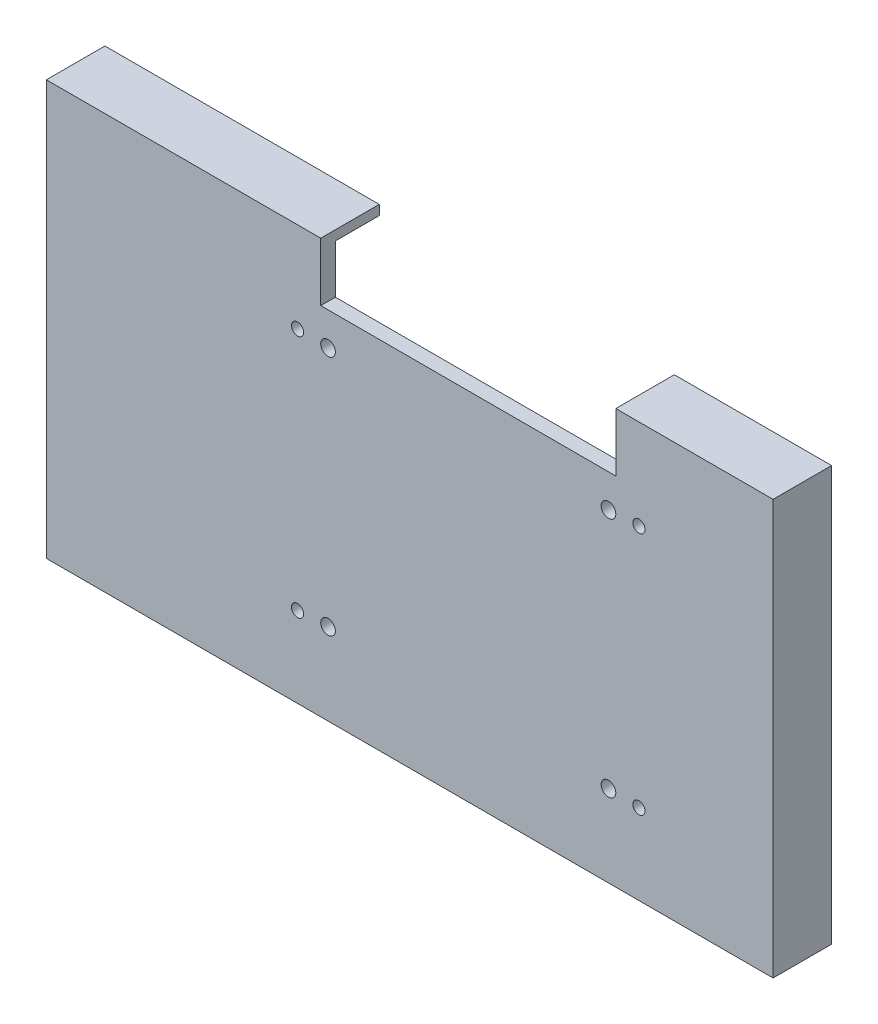
ISO-10303-21;
HEADER;
FILE_DESCRIPTION(('STEP AP214'),'2;1');
FILE_NAME('part.step','',(''),(''),'','','');
FILE_SCHEMA(('AUTOMOTIVE_DESIGN { 1 0 10303 214 1 1 1 1 }'));
ENDSEC;
DATA;
#1=APPLICATION_CONTEXT('core data for automotive mechanical design processes');
#2=APPLICATION_PROTOCOL_DEFINITION('international standard','automotive_design',2000,#1);
#3=PRODUCT_CONTEXT('',#1,'mechanical');
#4=PRODUCT('Part','Part','',(#3));
#5=PRODUCT_RELATED_PRODUCT_CATEGORY('part','',(#4));
#6=PRODUCT_DEFINITION_FORMATION('','',#4);
#7=PRODUCT_DEFINITION_CONTEXT('part definition',#1,'design');
#8=PRODUCT_DEFINITION('design','',#6,#7);
#9=PRODUCT_DEFINITION_SHAPE('','',#8);
#10=(LENGTH_UNIT() NAMED_UNIT(*) SI_UNIT(.MILLI.,.METRE.));
#11=(NAMED_UNIT(*) PLANE_ANGLE_UNIT() SI_UNIT($,.RADIAN.));
#12=(NAMED_UNIT(*) SI_UNIT($,.STERADIAN.) SOLID_ANGLE_UNIT());
#13=UNCERTAINTY_MEASURE_WITH_UNIT(LENGTH_MEASURE(1.E-05),#10,'distance_accuracy_value','');
#14=(GEOMETRIC_REPRESENTATION_CONTEXT(3) GLOBAL_UNCERTAINTY_ASSIGNED_CONTEXT((#13)) GLOBAL_UNIT_ASSIGNED_CONTEXT((#10,
#11,#12)) REPRESENTATION_CONTEXT('',''));
#15=CARTESIAN_POINT('',(0.,0.,0.));
#16=DIRECTION('',(0.,0.,1.));
#17=DIRECTION('',(1.,0.,0.));
#18=AXIS2_PLACEMENT_3D('',#15,#16,#17);
#19=CARTESIAN_POINT('',(0.,-15.,-3.));
#20=DIRECTION('',(0.,-1.,0.));
#21=DIRECTION('',(0.,0.,-1.));
#22=AXIS2_PLACEMENT_3D('',#19,#20,#21);
#23=PLANE('',#22);
#24=DIRECTION('',(0.,0.,1.));
#25=VECTOR('',#24,1.);
#26=CARTESIAN_POINT('',(-63.6600662353482,-15.,-3.));
#27=LINE('',#26,#25);
#28=CARTESIAN_POINT('',(-63.6600662353482,-15.,-3.));
#29=VERTEX_POINT('',#28);
#30=CARTESIAN_POINT('',(-63.6600662353482,-15.,-1.));
#31=VERTEX_POINT('',#30);
#32=EDGE_CURVE('E86',#29,#31,#27,.T.);
#33=ORIENTED_EDGE('',*,*,#32,.T.);
#34=DIRECTION('',(-1.,0.,0.));
#35=VECTOR('',#34,1.);
#36=CARTESIAN_POINT('',(0.,-15.,-1.));
#37=LINE('',#36,#35);
#38=CARTESIAN_POINT('',(-86.5,-15.,-1.));
#39=VERTEX_POINT('',#38);
#40=EDGE_CURVE('E292',#31,#39,#37,.T.);
#41=ORIENTED_EDGE('',*,*,#40,.T.);
#42=DIRECTION('',(0.,0.,1.));
#43=VECTOR('',#42,1.);
#44=CARTESIAN_POINT('',(-86.5,-15.,-12.));
#45=LINE('',#44,#43);
#46=CARTESIAN_POINT('',(-86.5,-15.,-12.));
#47=VERTEX_POINT('',#46);
#48=EDGE_CURVE('E340',#47,#39,#45,.T.);
#49=ORIENTED_EDGE('',*,*,#48,.F.);
#50=DIRECTION('',(1.,0.,0.));
#51=VECTOR('',#50,1.);
#52=CARTESIAN_POINT('',(0.,-15.,-12.));
#53=LINE('',#52,#51);
#54=CARTESIAN_POINT('',(-84.5,-15.,-12.));
#55=VERTEX_POINT('',#54);
#56=EDGE_CURVE('E326',#47,#55,#53,.T.);
#57=ORIENTED_EDGE('',*,*,#56,.T.);
#58=DIRECTION('',(0.,0.,1.));
#59=VECTOR('',#58,1.);
#60=CARTESIAN_POINT('',(-84.5,-15.,-12.));
#61=LINE('',#60,#59);
#62=CARTESIAN_POINT('',(-84.5,-15.,-3.));
#63=VERTEX_POINT('',#62);
#64=EDGE_CURVE('E355',#55,#63,#61,.T.);
#65=ORIENTED_EDGE('',*,*,#64,.T.);
#66=DIRECTION('',(1.,0.,0.));
#67=VECTOR('',#66,1.);
#68=CARTESIAN_POINT('',(0.,-15.,-3.));
#69=LINE('',#68,#67);
#70=EDGE_CURVE('E216',#63,#29,#69,.T.);
#71=ORIENTED_EDGE('',*,*,#70,.T.);
#72=EDGE_LOOP('',(#33,#41,#49,#57,#65,#71));
#73=FACE_BOUND('',#72,.T.);
#74=ADVANCED_FACE('F82',(#73),#23,.T.);
#75=CARTESIAN_POINT('',(0.,-30.,-3.));
#76=DIRECTION('',(0.,-1.,0.));
#77=DIRECTION('',(0.,0.,-1.));
#78=AXIS2_PLACEMENT_3D('',#75,#76,#77);
#79=PLANE('',#78);
#80=DIRECTION('',(-1.,0.,0.));
#81=VECTOR('',#80,1.);
#82=CARTESIAN_POINT('',(0.,-30.,-1.));
#83=LINE('',#82,#81);
#84=CARTESIAN_POINT('',(-63.6600662353482,-30.,-1.));
#85=VERTEX_POINT('',#84);
#86=CARTESIAN_POINT('',(-86.5,-30.,-1.));
#87=VERTEX_POINT('',#86);
#88=EDGE_CURVE('E308',#85,#87,#83,.T.);
#89=ORIENTED_EDGE('',*,*,#88,.F.);
#90=DIRECTION('',(0.,0.,1.));
#91=VECTOR('',#90,1.);
#92=CARTESIAN_POINT('',(-63.6600662353482,-30.,-3.));
#93=LINE('',#92,#91);
#94=CARTESIAN_POINT('',(-63.6600662353482,-30.,-3.));
#95=VERTEX_POINT('',#94);
#96=EDGE_CURVE('E279',#95,#85,#93,.T.);
#97=ORIENTED_EDGE('',*,*,#96,.F.);
#98=DIRECTION('',(1.,0.,0.));
#99=VECTOR('',#98,1.);
#100=CARTESIAN_POINT('',(0.,-30.,-3.));
#101=LINE('',#100,#99);
#102=CARTESIAN_POINT('',(-84.5,-30.,-3.));
#103=VERTEX_POINT('',#102);
#104=EDGE_CURVE('E222',#103,#95,#101,.T.);
#105=ORIENTED_EDGE('',*,*,#104,.F.);
#106=DIRECTION('',(0.,0.,1.));
#107=VECTOR('',#106,1.);
#108=CARTESIAN_POINT('',(-84.5,-30.,-12.));
#109=LINE('',#108,#107);
#110=CARTESIAN_POINT('',(-84.5,-30.,-12.));
#111=VERTEX_POINT('',#110);
#112=EDGE_CURVE('E251',#111,#103,#109,.T.);
#113=ORIENTED_EDGE('',*,*,#112,.F.);
#114=DIRECTION('',(1.,0.,0.));
#115=VECTOR('',#114,1.);
#116=CARTESIAN_POINT('',(0.,-30.,-12.));
#117=LINE('',#116,#115);
#118=CARTESIAN_POINT('',(-86.5,-30.,-12.));
#119=VERTEX_POINT('',#118);
#120=EDGE_CURVE('E358',#119,#111,#117,.T.);
#121=ORIENTED_EDGE('',*,*,#120,.F.);
#122=DIRECTION('',(0.,0.,1.));
#123=VECTOR('',#122,1.);
#124=CARTESIAN_POINT('',(-86.5,-30.,-12.));
#125=LINE('',#124,#123);
#126=EDGE_CURVE('E200',#119,#87,#125,.T.);
#127=ORIENTED_EDGE('',*,*,#126,.T.);
#128=EDGE_LOOP('',(#89,#97,#105,#113,#121,#127));
#129=FACE_BOUND('',#128,.T.);
#130=ADVANCED_FACE('F306',(#129),#79,.F.);
#131=CARTESIAN_POINT('',(-63.6600662353482,0.,-3.));
#132=DIRECTION('',(-1.,0.,0.));
#133=DIRECTION('',(0.,0.,1.));
#134=AXIS2_PLACEMENT_3D('',#131,#132,#133);
#135=PLANE('',#134);
#136=ORIENTED_EDGE('',*,*,#96,.T.);
#137=DIRECTION('',(0.,1.,0.));
#138=VECTOR('',#137,1.);
#139=CARTESIAN_POINT('',(-63.6600662353482,0.,-1.));
#140=LINE('',#139,#138);
#141=EDGE_CURVE('E299',#85,#31,#140,.T.);
#142=ORIENTED_EDGE('',*,*,#141,.T.);
#143=ORIENTED_EDGE('',*,*,#32,.F.);
#144=DIRECTION('',(0.,-1.,0.));
#145=VECTOR('',#144,1.);
#146=CARTESIAN_POINT('',(-63.6600662353482,0.,-3.));
#147=LINE('',#146,#145);
#148=EDGE_CURVE('E219',#29,#95,#147,.T.);
#149=ORIENTED_EDGE('',*,*,#148,.T.);
#150=EDGE_LOOP('',(#136,#142,#143,#149));
#151=FACE_BOUND('',#150,.T.);
#152=ADVANCED_FACE('F297',(#151),#135,.T.);
#153=CARTESIAN_POINT('',(-30.25,0.,-3.));
#154=DIRECTION('',(-1.,0.,0.));
#155=DIRECTION('',(0.,0.,1.));
#156=AXIS2_PLACEMENT_3D('',#153,#154,#155);
#157=PLANE('',#156);
#158=DIRECTION('',(0.,-1.,0.));
#159=VECTOR('',#158,1.);
#160=CARTESIAN_POINT('',(-30.25,0.,0.));
#161=LINE('',#160,#159);
#162=CARTESIAN_POINT('',(-30.25,43.5,0.));
#163=VERTEX_POINT('',#162);
#164=CARTESIAN_POINT('',(-30.25,31.5205042156634,0.));
#165=VERTEX_POINT('',#164);
#166=EDGE_CURVE('E265',#163,#165,#161,.T.);
#167=ORIENTED_EDGE('',*,*,#166,.T.);
#168=DIRECTION('',(0.,0.,1.));
#169=VECTOR('',#168,1.);
#170=CARTESIAN_POINT('',(-30.25,31.5205042156634,-3.));
#171=LINE('',#170,#169);
#172=CARTESIAN_POINT('',(-30.25,31.5205042156634,-3.));
#173=VERTEX_POINT('',#172);
#174=EDGE_CURVE('E12',#173,#165,#171,.T.);
#175=ORIENTED_EDGE('',*,*,#174,.F.);
#176=DIRECTION('',(0.,-1.,0.));
#177=VECTOR('',#176,1.);
#178=CARTESIAN_POINT('',(-30.25,0.,-3.));
#179=LINE('',#178,#177);
#180=CARTESIAN_POINT('',(-30.25,41.5,-3.));
#181=VERTEX_POINT('',#180);
#182=EDGE_CURVE('E233',#181,#173,#179,.T.);
#183=ORIENTED_EDGE('',*,*,#182,.F.);
#184=DIRECTION('',(0.,0.,1.));
#185=VECTOR('',#184,1.);
#186=CARTESIAN_POINT('',(-30.25,41.5,-12.));
#187=LINE('',#186,#185);
#188=CARTESIAN_POINT('',(-30.25,41.5,-12.));
#189=VERTEX_POINT('',#188);
#190=EDGE_CURVE('E349',#189,#181,#187,.T.);
#191=ORIENTED_EDGE('',*,*,#190,.F.);
#192=DIRECTION('',(0.,-1.,0.));
#193=VECTOR('',#192,1.);
#194=CARTESIAN_POINT('',(-30.25,0.,-12.));
#195=LINE('',#194,#193);
#196=CARTESIAN_POINT('',(-30.25,43.5,-12.));
#197=VERTEX_POINT('',#196);
#198=EDGE_CURVE('E335',#197,#189,#195,.T.);
#199=ORIENTED_EDGE('',*,*,#198,.F.);
#200=DIRECTION('',(0.,0.,1.));
#201=VECTOR('',#200,1.);
#202=CARTESIAN_POINT('',(-30.25,43.5,-12.));
#203=LINE('',#202,#201);
#204=EDGE_CURVE('E346',#197,#163,#203,.T.);
#205=ORIENTED_EDGE('',*,*,#204,.T.);
#206=EDGE_LOOP('',(#167,#175,#183,#191,#199,#205));
#207=FACE_BOUND('',#206,.T.);
#208=ADVANCED_FACE('F467',(#207),#157,.F.);
#209=CARTESIAN_POINT('',(0.,31.5205042156634,-3.));
#210=DIRECTION('',(0.,-1.,0.));
#211=DIRECTION('',(1.,0.,0.));
#212=AXIS2_PLACEMENT_3D('',#209,#210,#211);
#213=PLANE('',#212);
#214=DIRECTION('',(1.,0.,0.));
#215=VECTOR('',#214,1.);
#216=CARTESIAN_POINT('',(0.,31.5205042156634,0.));
#217=LINE('',#216,#215);
#218=CARTESIAN_POINT('',(30.25,31.5205042156634,0.));
#219=VERTEX_POINT('',#218);
#220=EDGE_CURVE('E263',#165,#219,#217,.T.);
#221=ORIENTED_EDGE('',*,*,#220,.T.);
#222=DIRECTION('',(0.,0.,1.));
#223=VECTOR('',#222,1.);
#224=CARTESIAN_POINT('',(30.25,31.5205042156634,-3.));
#225=LINE('',#224,#223);
#226=CARTESIAN_POINT('',(30.25,31.5205042156634,-3.));
#227=VERTEX_POINT('',#226);
#228=EDGE_CURVE('E92',#227,#219,#225,.T.);
#229=ORIENTED_EDGE('',*,*,#228,.F.);
#230=DIRECTION('',(1.,0.,0.));
#231=VECTOR('',#230,1.);
#232=CARTESIAN_POINT('',(0.,31.5205042156634,-3.));
#233=LINE('',#232,#231);
#234=EDGE_CURVE('E100',#173,#227,#233,.T.);
#235=ORIENTED_EDGE('',*,*,#234,.F.);
#236=ORIENTED_EDGE('',*,*,#174,.T.);
#237=EDGE_LOOP('',(#221,#229,#235,#236));
#238=FACE_BOUND('',#237,.T.);
#239=ADVANCED_FACE('F468',(#238),#213,.F.);
#240=CARTESIAN_POINT('',(30.25,0.,-3.));
#241=DIRECTION('',(-1.,0.,0.));
#242=DIRECTION('',(0.,-1.,0.));
#243=AXIS2_PLACEMENT_3D('',#240,#241,#242);
#244=PLANE('',#243);
#245=DIRECTION('',(0.,-1.,0.));
#246=VECTOR('',#245,1.);
#247=CARTESIAN_POINT('',(30.25,0.,0.));
#248=LINE('',#247,#246);
#249=CARTESIAN_POINT('',(30.25,43.5,0.));
#250=VERTEX_POINT('',#249);
#251=EDGE_CURVE('E260',#250,#219,#248,.T.);
#252=ORIENTED_EDGE('',*,*,#251,.F.);
#253=DIRECTION('',(0.,0.,1.));
#254=VECTOR('',#253,1.);
#255=CARTESIAN_POINT('',(30.25,43.5,-12.));
#256=LINE('',#255,#254);
#257=CARTESIAN_POINT('',(30.25,43.5,-12.));
#258=VERTEX_POINT('',#257);
#259=EDGE_CURVE('E185',#258,#250,#256,.T.);
#260=ORIENTED_EDGE('',*,*,#259,.F.);
#261=DIRECTION('',(0.,-1.,0.));
#262=VECTOR('',#261,1.);
#263=CARTESIAN_POINT('',(30.25,0.,-12.));
#264=LINE('',#263,#262);
#265=CARTESIAN_POINT('',(30.25,41.5,-12.));
#266=VERTEX_POINT('',#265);
#267=EDGE_CURVE('E184',#258,#266,#264,.T.);
#268=ORIENTED_EDGE('',*,*,#267,.T.);
#269=DIRECTION('',(0.,0.,1.));
#270=VECTOR('',#269,1.);
#271=CARTESIAN_POINT('',(30.25,41.5,-12.));
#272=LINE('',#271,#270);
#273=CARTESIAN_POINT('',(30.25,41.5,-3.));
#274=VERTEX_POINT('',#273);
#275=EDGE_CURVE('E173',#266,#274,#272,.T.);
#276=ORIENTED_EDGE('',*,*,#275,.T.);
#277=DIRECTION('',(0.,-1.,0.));
#278=VECTOR('',#277,1.);
#279=CARTESIAN_POINT('',(30.25,0.,-3.));
#280=LINE('',#279,#278);
#281=EDGE_CURVE('E158',#274,#227,#280,.T.);
#282=ORIENTED_EDGE('',*,*,#281,.T.);
#283=ORIENTED_EDGE('',*,*,#228,.T.);
#284=EDGE_LOOP('',(#252,#260,#268,#276,#282,#283));
#285=FACE_BOUND('',#284,.T.);
#286=ADVANCED_FACE('F181',(#285),#244,.T.);
#287=CARTESIAN_POINT('',(35.,-25.,-3.));
#288=DIRECTION('',(0.,0.,1.));
#289=DIRECTION('',(1.,0.,0.));
#290=AXIS2_PLACEMENT_3D('',#287,#288,#289);
#291=CYLINDRICAL_SURFACE('',#290,1.25);
#292=CARTESIAN_POINT('',(35.,-25.,-3.));
#293=DIRECTION('',(0.,0.,1.));
#294=DIRECTION('',(1.,0.,0.));
#295=AXIS2_PLACEMENT_3D('',#292,#293,#294);
#296=CIRCLE('',#295,1.25);
#297=CARTESIAN_POINT('',(36.25,-25.,-3.));
#298=VERTEX_POINT('',#297);
#299=EDGE_CURVE('E241',#298,#298,#296,.T.);
#300=ORIENTED_EDGE('',*,*,#299,.F.);
#301=EDGE_LOOP('',(#300));
#302=FACE_BOUND('',#301,.T.);
#303=CARTESIAN_POINT('',(35.,-25.,0.));
#304=DIRECTION('',(0.,0.,1.));
#305=DIRECTION('',(1.,0.,0.));
#306=AXIS2_PLACEMENT_3D('',#303,#304,#305);
#307=CIRCLE('',#306,1.25);
#308=CARTESIAN_POINT('',(36.25,-25.,0.));
#309=VERTEX_POINT('',#308);
#310=EDGE_CURVE('E274',#309,#309,#307,.T.);
#311=ORIENTED_EDGE('',*,*,#310,.T.);
#312=EDGE_LOOP('',(#311));
#313=FACE_BOUND('',#312,.T.);
#314=ADVANCED_FACE('F545',(#302,#313),#291,.F.);
#315=CARTESIAN_POINT('',(-28.75,-24.75,-3.));
#316=DIRECTION('',(0.,0.,1.));
#317=DIRECTION('',(1.,0.,0.));
#318=AXIS2_PLACEMENT_3D('',#315,#316,#317);
#319=CYLINDRICAL_SURFACE('',#318,1.5);
#320=CARTESIAN_POINT('',(-28.75,-24.75,-3.));
#321=DIRECTION('',(0.,0.,1.));
#322=DIRECTION('',(1.,0.,0.));
#323=AXIS2_PLACEMENT_3D('',#320,#321,#322);
#324=CIRCLE('',#323,1.5);
#325=CARTESIAN_POINT('',(-27.25,-24.75,-3.));
#326=VERTEX_POINT('',#325);
#327=EDGE_CURVE('E238',#326,#326,#324,.F.);
#328=ORIENTED_EDGE('',*,*,#327,.T.);
#329=EDGE_LOOP('',(#328));
#330=FACE_BOUND('',#329,.T.);
#331=CARTESIAN_POINT('',(-28.75,-24.75,0.));
#332=DIRECTION('',(0.,0.,1.));
#333=DIRECTION('',(1.,0.,0.));
#334=AXIS2_PLACEMENT_3D('',#331,#332,#333);
#335=CIRCLE('',#334,1.5);
#336=CARTESIAN_POINT('',(-27.25,-24.75,0.));
#337=VERTEX_POINT('',#336);
#338=EDGE_CURVE('E271',#337,#337,#335,.F.);
#339=ORIENTED_EDGE('',*,*,#338,.F.);
#340=EDGE_LOOP('',(#339));
#341=FACE_BOUND('',#340,.T.);
#342=ADVANCED_FACE('F548',(#330,#341),#319,.F.);
#343=CARTESIAN_POINT('',(28.75,-24.75,-3.));
#344=DIRECTION('',(0.,0.,1.));
#345=DIRECTION('',(1.,0.,0.));
#346=AXIS2_PLACEMENT_3D('',#343,#344,#345);
#347=CYLINDRICAL_SURFACE('',#346,1.5);
#348=CARTESIAN_POINT('',(28.75,-24.75,-3.));
#349=DIRECTION('',(0.,0.,1.));
#350=DIRECTION('',(1.,0.,0.));
#351=AXIS2_PLACEMENT_3D('',#348,#349,#350);
#352=CIRCLE('',#351,1.5);
#353=CARTESIAN_POINT('',(30.25,-24.75,-3.));
#354=VERTEX_POINT('',#353);
#355=EDGE_CURVE('E235',#354,#354,#352,.T.);
#356=ORIENTED_EDGE('',*,*,#355,.F.);
#357=EDGE_LOOP('',(#356));
#358=FACE_BOUND('',#357,.T.);
#359=CARTESIAN_POINT('',(28.75,-24.75,0.));
#360=DIRECTION('',(0.,0.,1.));
#361=DIRECTION('',(1.,0.,0.));
#362=AXIS2_PLACEMENT_3D('',#359,#360,#361);
#363=CIRCLE('',#362,1.5);
#364=CARTESIAN_POINT('',(30.25,-24.75,0.));
#365=VERTEX_POINT('',#364);
#366=EDGE_CURVE('E268',#365,#365,#363,.T.);
#367=ORIENTED_EDGE('',*,*,#366,.T.);
#368=EDGE_LOOP('',(#367));
#369=FACE_BOUND('',#368,.T.);
#370=ADVANCED_FACE('F504',(#358,#369),#347,.F.);
#371=CARTESIAN_POINT('',(-28.75,24.75,-3.));
#372=DIRECTION('',(0.,0.,1.));
#373=DIRECTION('',(1.,0.,0.));
#374=AXIS2_PLACEMENT_3D('',#371,#372,#373);
#375=CYLINDRICAL_SURFACE('',#374,1.5);
#376=CARTESIAN_POINT('',(-28.75,24.75,-3.));
#377=DIRECTION('',(0.,0.,1.));
#378=DIRECTION('',(1.,0.,0.));
#379=AXIS2_PLACEMENT_3D('',#376,#377,#378);
#380=CIRCLE('',#379,1.5);
#381=CARTESIAN_POINT('',(-27.25,24.75,-3.));
#382=VERTEX_POINT('',#381);
#383=EDGE_CURVE('E213',#382,#382,#380,.T.);
#384=ORIENTED_EDGE('',*,*,#383,.F.);
#385=EDGE_LOOP('',(#384));
#386=FACE_BOUND('',#385,.T.);
#387=CARTESIAN_POINT('',(-28.75,24.75,0.));
#388=DIRECTION('',(0.,0.,1.));
#389=DIRECTION('',(1.,0.,0.));
#390=AXIS2_PLACEMENT_3D('',#387,#388,#389);
#391=CIRCLE('',#390,1.5);
#392=CARTESIAN_POINT('',(-27.25,24.75,0.));
#393=VERTEX_POINT('',#392);
#394=EDGE_CURVE('E257',#393,#393,#391,.T.);
#395=ORIENTED_EDGE('',*,*,#394,.T.);
#396=EDGE_LOOP('',(#395));
#397=FACE_BOUND('',#396,.T.);
#398=ADVANCED_FACE('F500',(#386,#397),#375,.F.);
#399=CARTESIAN_POINT('',(28.75,24.75,-3.));
#400=DIRECTION('',(0.,0.,1.));
#401=DIRECTION('',(1.,0.,0.));
#402=AXIS2_PLACEMENT_3D('',#399,#400,#401);
#403=CYLINDRICAL_SURFACE('',#402,1.5);
#404=CARTESIAN_POINT('',(28.75,24.75,-3.));
#405=DIRECTION('',(0.,0.,1.));
#406=DIRECTION('',(1.,0.,0.));
#407=AXIS2_PLACEMENT_3D('',#404,#405,#406);
#408=CIRCLE('',#407,1.5);
#409=CARTESIAN_POINT('',(30.25,24.75,-3.));
#410=VERTEX_POINT('',#409);
#411=EDGE_CURVE('E210',#410,#410,#408,.F.);
#412=ORIENTED_EDGE('',*,*,#411,.T.);
#413=EDGE_LOOP('',(#412));
#414=FACE_BOUND('',#413,.T.);
#415=CARTESIAN_POINT('',(28.75,24.75,0.));
#416=DIRECTION('',(0.,0.,1.));
#417=DIRECTION('',(1.,0.,0.));
#418=AXIS2_PLACEMENT_3D('',#415,#416,#417);
#419=CIRCLE('',#418,1.5);
#420=CARTESIAN_POINT('',(30.25,24.75,0.));
#421=VERTEX_POINT('',#420);
#422=EDGE_CURVE('E254',#421,#421,#419,.F.);
#423=ORIENTED_EDGE('',*,*,#422,.F.);
#424=EDGE_LOOP('',(#423));
#425=FACE_BOUND('',#424,.T.);
#426=ADVANCED_FACE('F503',(#414,#425),#403,.F.);
#427=CARTESIAN_POINT('',(-35.,25.,-3.));
#428=DIRECTION('',(0.,0.,1.));
#429=DIRECTION('',(1.,0.,0.));
#430=AXIS2_PLACEMENT_3D('',#427,#428,#429);
#431=CYLINDRICAL_SURFACE('',#430,1.25);
#432=CARTESIAN_POINT('',(-35.,25.,-3.));
#433=DIRECTION('',(0.,0.,1.));
#434=DIRECTION('',(1.,0.,0.));
#435=AXIS2_PLACEMENT_3D('',#432,#433,#434);
#436=CIRCLE('',#435,1.25);
#437=CARTESIAN_POINT('',(-33.75,25.,-3.));
#438=VERTEX_POINT('',#437);
#439=EDGE_CURVE('E206',#438,#438,#436,.T.);
#440=ORIENTED_EDGE('',*,*,#439,.F.);
#441=EDGE_LOOP('',(#440));
#442=FACE_BOUND('',#441,.T.);
#443=CARTESIAN_POINT('',(-35.,25.,0.));
#444=DIRECTION('',(0.,0.,1.));
#445=DIRECTION('',(1.,0.,0.));
#446=AXIS2_PLACEMENT_3D('',#443,#444,#445);
#447=CIRCLE('',#446,1.25);
#448=CARTESIAN_POINT('',(-33.75,25.,0.));
#449=VERTEX_POINT('',#448);
#450=EDGE_CURVE('E250',#449,#449,#447,.T.);
#451=ORIENTED_EDGE('',*,*,#450,.T.);
#452=EDGE_LOOP('',(#451));
#453=FACE_BOUND('',#452,.T.);
#454=ADVANCED_FACE('F507',(#442,#453),#431,.F.);
#455=CARTESIAN_POINT('',(35.,25.,-3.));
#456=DIRECTION('',(0.,0.,1.));
#457=DIRECTION('',(1.,0.,0.));
#458=AXIS2_PLACEMENT_3D('',#455,#456,#457);
#459=CYLINDRICAL_SURFACE('',#458,1.25);
#460=CARTESIAN_POINT('',(35.,25.,-3.));
#461=DIRECTION('',(0.,0.,1.));
#462=DIRECTION('',(1.,0.,0.));
#463=AXIS2_PLACEMENT_3D('',#460,#461,#462);
#464=CIRCLE('',#463,1.25);
#465=CARTESIAN_POINT('',(36.25,25.,-3.));
#466=VERTEX_POINT('',#465);
#467=EDGE_CURVE('E203',#466,#466,#464,.F.);
#468=ORIENTED_EDGE('',*,*,#467,.T.);
#469=EDGE_LOOP('',(#468));
#470=FACE_BOUND('',#469,.T.);
#471=CARTESIAN_POINT('',(35.,25.,0.));
#472=DIRECTION('',(0.,0.,1.));
#473=DIRECTION('',(1.,0.,0.));
#474=AXIS2_PLACEMENT_3D('',#471,#472,#473);
#475=CIRCLE('',#474,1.25);
#476=CARTESIAN_POINT('',(36.25,25.,0.));
#477=VERTEX_POINT('',#476);
#478=EDGE_CURVE('E247',#477,#477,#475,.F.);
#479=ORIENTED_EDGE('',*,*,#478,.F.);
#480=EDGE_LOOP('',(#479));
#481=FACE_BOUND('',#480,.T.);
#482=ADVANCED_FACE('F84',(#470,#481),#459,.F.);
#483=CARTESIAN_POINT('',(-35.,-25.,-3.));
#484=DIRECTION('',(0.,0.,1.));
#485=DIRECTION('',(1.,0.,0.));
#486=AXIS2_PLACEMENT_3D('',#483,#484,#485);
#487=CYLINDRICAL_SURFACE('',#486,1.25);
#488=CARTESIAN_POINT('',(-35.,-25.,-3.));
#489=DIRECTION('',(0.,0.,1.));
#490=DIRECTION('',(1.,0.,0.));
#491=AXIS2_PLACEMENT_3D('',#488,#489,#490);
#492=CIRCLE('',#491,1.25);
#493=CARTESIAN_POINT('',(-33.75,-25.,-3.));
#494=VERTEX_POINT('',#493);
#495=EDGE_CURVE('E244',#494,#494,#492,.F.);
#496=ORIENTED_EDGE('',*,*,#495,.T.);
#497=EDGE_LOOP('',(#496));
#498=FACE_BOUND('',#497,.T.);
#499=CARTESIAN_POINT('',(-35.,-25.,0.));
#500=DIRECTION('',(0.,0.,1.));
#501=DIRECTION('',(1.,0.,0.));
#502=AXIS2_PLACEMENT_3D('',#499,#500,#501);
#503=CIRCLE('',#502,1.25);
#504=CARTESIAN_POINT('',(-33.75,-25.,0.));
#505=VERTEX_POINT('',#504);
#506=EDGE_CURVE('E207',#505,#505,#503,.F.);
#507=ORIENTED_EDGE('',*,*,#506,.F.);
#508=EDGE_LOOP('',(#507));
#509=FACE_BOUND('',#508,.T.);
#510=ADVANCED_FACE('F514',(#498,#509),#487,.F.);
#511=CARTESIAN_POINT('',(0.,0.,-3.));
#512=DIRECTION('',(0.,0.,1.));
#513=DIRECTION('',(1.,0.,0.));
#514=AXIS2_PLACEMENT_3D('',#511,#512,#513);
#515=PLANE('',#514);
#516=ORIENTED_EDGE('',*,*,#467,.F.);
#517=EDGE_LOOP('',(#516));
#518=FACE_BOUND('',#517,.T.);
#519=ORIENTED_EDGE('',*,*,#439,.T.);
#520=EDGE_LOOP('',(#519));
#521=FACE_BOUND('',#520,.T.);
#522=ORIENTED_EDGE('',*,*,#411,.F.);
#523=EDGE_LOOP('',(#522));
#524=FACE_BOUND('',#523,.T.);
#525=ORIENTED_EDGE('',*,*,#383,.T.);
#526=EDGE_LOOP('',(#525));
#527=FACE_BOUND('',#526,.T.);
#528=ORIENTED_EDGE('',*,*,#70,.F.);
#529=DIRECTION('',(0.,-1.,0.));
#530=VECTOR('',#529,1.);
#531=CARTESIAN_POINT('',(-84.5,0.,-3.));
#532=LINE('',#531,#530);
#533=CARTESIAN_POINT('',(-84.5,41.5,-3.));
#534=VERTEX_POINT('',#533);
#535=EDGE_CURVE('E228',#534,#63,#532,.T.);
#536=ORIENTED_EDGE('',*,*,#535,.F.);
#537=DIRECTION('',(1.,0.,0.));
#538=VECTOR('',#537,1.);
#539=CARTESIAN_POINT('',(0.,41.5,-3.));
#540=LINE('',#539,#538);
#541=EDGE_CURVE('E179',#534,#181,#540,.T.);
#542=ORIENTED_EDGE('',*,*,#541,.T.);
#543=ORIENTED_EDGE('',*,*,#182,.T.);
#544=ORIENTED_EDGE('',*,*,#234,.T.);
#545=ORIENTED_EDGE('',*,*,#281,.F.);
#546=CARTESIAN_POINT('',(60.5,41.5,-3.));
#547=VERTEX_POINT('',#546);
#548=EDGE_CURVE('E163',#274,#547,#540,.T.);
#549=ORIENTED_EDGE('',*,*,#548,.T.);
#550=DIRECTION('',(0.,-1.,0.));
#551=VECTOR('',#550,1.);
#552=CARTESIAN_POINT('',(60.5,0.,-3.));
#553=LINE('',#552,#551);
#554=CARTESIAN_POINT('',(60.5,-39.5,-3.));
#555=VERTEX_POINT('',#554);
#556=EDGE_CURVE('E177',#547,#555,#553,.T.);
#557=ORIENTED_EDGE('',*,*,#556,.T.);
#558=DIRECTION('',(1.,0.,0.));
#559=VECTOR('',#558,1.);
#560=CARTESIAN_POINT('',(0.,-39.5,-3.));
#561=LINE('',#560,#559);
#562=CARTESIAN_POINT('',(-84.5,-39.5,-3.));
#563=VERTEX_POINT('',#562);
#564=EDGE_CURVE('E227',#563,#555,#561,.T.);
#565=ORIENTED_EDGE('',*,*,#564,.F.);
#566=EDGE_CURVE('E224',#103,#563,#532,.T.);
#567=ORIENTED_EDGE('',*,*,#566,.F.);
#568=ORIENTED_EDGE('',*,*,#104,.T.);
#569=ORIENTED_EDGE('',*,*,#148,.F.);
#570=EDGE_LOOP('',(#528,#536,#542,#543,#544,#545,#549,#557,#565,#567,#568,#569));
#571=FACE_BOUND('',#570,.T.);
#572=ORIENTED_EDGE('',*,*,#355,.T.);
#573=EDGE_LOOP('',(#572));
#574=FACE_BOUND('',#573,.T.);
#575=ORIENTED_EDGE('',*,*,#327,.F.);
#576=EDGE_LOOP('',(#575));
#577=FACE_BOUND('',#576,.T.);
#578=ORIENTED_EDGE('',*,*,#299,.T.);
#579=EDGE_LOOP('',(#578));
#580=FACE_BOUND('',#579,.T.);
#581=ORIENTED_EDGE('',*,*,#495,.F.);
#582=EDGE_LOOP('',(#581));
#583=FACE_BOUND('',#582,.T.);
#584=ADVANCED_FACE('F161',(#518,#521,#524,#527,#571,#574,#577,#580,#583),#515,.F.);
#585=CARTESIAN_POINT('',(0.,0.,0.));
#586=DIRECTION('',(0.,0.,1.));
#587=DIRECTION('',(1.,0.,0.));
#588=AXIS2_PLACEMENT_3D('',#585,#586,#587);
#589=PLANE('',#588);
#590=ORIENTED_EDGE('',*,*,#166,.F.);
#591=DIRECTION('',(1.,0.,0.));
#592=VECTOR('',#591,1.);
#593=CARTESIAN_POINT('',(0.,43.5,0.));
#594=LINE('',#593,#592);
#595=CARTESIAN_POINT('',(-86.5,43.5,0.));
#596=VERTEX_POINT('',#595);
#597=EDGE_CURVE('E316',#596,#163,#594,.T.);
#598=ORIENTED_EDGE('',*,*,#597,.F.);
#599=DIRECTION('',(0.,-1.,0.));
#600=VECTOR('',#599,1.);
#601=CARTESIAN_POINT('',(-86.5,0.,0.));
#602=LINE('',#601,#600);
#603=CARTESIAN_POINT('',(-86.5,-41.5,0.));
#604=VERTEX_POINT('',#603);
#605=EDGE_CURVE('E345',#596,#604,#602,.T.);
#606=ORIENTED_EDGE('',*,*,#605,.T.);
#607=DIRECTION('',(1.,0.,0.));
#608=VECTOR('',#607,1.);
#609=CARTESIAN_POINT('',(0.,-41.5,0.));
#610=LINE('',#609,#608);
#611=CARTESIAN_POINT('',(62.5,-41.5,0.));
#612=VERTEX_POINT('',#611);
#613=EDGE_CURVE('E385',#604,#612,#610,.T.);
#614=ORIENTED_EDGE('',*,*,#613,.T.);
#615=DIRECTION('',(0.,-1.,0.));
#616=VECTOR('',#615,1.);
#617=CARTESIAN_POINT('',(62.5,0.,0.));
#618=LINE('',#617,#616);
#619=CARTESIAN_POINT('',(62.5,43.5,0.));
#620=VERTEX_POINT('',#619);
#621=EDGE_CURVE('E388',#620,#612,#618,.T.);
#622=ORIENTED_EDGE('',*,*,#621,.F.);
#623=DIRECTION('',(1.,0.,0.));
#624=VECTOR('',#623,1.);
#625=CARTESIAN_POINT('',(0.,43.5,0.));
#626=LINE('',#625,#624);
#627=EDGE_CURVE('E361',#250,#620,#626,.T.);
#628=ORIENTED_EDGE('',*,*,#627,.F.);
#629=ORIENTED_EDGE('',*,*,#251,.T.);
#630=ORIENTED_EDGE('',*,*,#220,.F.);
#631=EDGE_LOOP('',(#590,#598,#606,#614,#622,#628,#629,#630));
#632=FACE_BOUND('',#631,.T.);
#633=ORIENTED_EDGE('',*,*,#478,.T.);
#634=EDGE_LOOP('',(#633));
#635=FACE_BOUND('',#634,.T.);
#636=ORIENTED_EDGE('',*,*,#450,.F.);
#637=EDGE_LOOP('',(#636));
#638=FACE_BOUND('',#637,.T.);
#639=ORIENTED_EDGE('',*,*,#422,.T.);
#640=EDGE_LOOP('',(#639));
#641=FACE_BOUND('',#640,.T.);
#642=ORIENTED_EDGE('',*,*,#394,.F.);
#643=EDGE_LOOP('',(#642));
#644=FACE_BOUND('',#643,.T.);
#645=ORIENTED_EDGE('',*,*,#366,.F.);
#646=EDGE_LOOP('',(#645));
#647=FACE_BOUND('',#646,.T.);
#648=ORIENTED_EDGE('',*,*,#338,.T.);
#649=EDGE_LOOP('',(#648));
#650=FACE_BOUND('',#649,.T.);
#651=ORIENTED_EDGE('',*,*,#310,.F.);
#652=EDGE_LOOP('',(#651));
#653=FACE_BOUND('',#652,.T.);
#654=ORIENTED_EDGE('',*,*,#506,.T.);
#655=EDGE_LOOP('',(#654));
#656=FACE_BOUND('',#655,.T.);
#657=ADVANCED_FACE('F471',(#632,#635,#638,#641,#644,#647,#650,#653,#656),#589,.T.);
#658=CARTESIAN_POINT('',(-84.5,0.,-12.));
#659=DIRECTION('',(-1.,0.,0.));
#660=DIRECTION('',(0.,-1.,0.));
#661=AXIS2_PLACEMENT_3D('',#658,#659,#660);
#662=PLANE('',#661);
#663=ORIENTED_EDGE('',*,*,#112,.T.);
#664=ORIENTED_EDGE('',*,*,#566,.T.);
#665=DIRECTION('',(0.,0.,1.));
#666=VECTOR('',#665,1.);
#667=CARTESIAN_POINT('',(-84.5,-39.5,-12.));
#668=LINE('',#667,#666);
#669=CARTESIAN_POINT('',(-84.5,-39.5,-12.));
#670=VERTEX_POINT('',#669);
#671=EDGE_CURVE('E393',#670,#563,#668,.T.);
#672=ORIENTED_EDGE('',*,*,#671,.F.);
#673=DIRECTION('',(0.,-1.,0.));
#674=VECTOR('',#673,1.);
#675=CARTESIAN_POINT('',(-84.5,0.,-12.));
#676=LINE('',#675,#674);
#677=EDGE_CURVE('E121',#111,#670,#676,.T.);
#678=ORIENTED_EDGE('',*,*,#677,.F.);
#679=EDGE_LOOP('',(#663,#664,#672,#678));
#680=FACE_BOUND('',#679,.T.);
#681=ADVANCED_FACE('F522',(#680),#662,.F.);
#682=CARTESIAN_POINT('',(0.,-39.5,-12.));
#683=DIRECTION('',(0.,-1.,0.));
#684=DIRECTION('',(0.,0.,-1.));
#685=AXIS2_PLACEMENT_3D('',#682,#683,#684);
#686=PLANE('',#685);
#687=ORIENTED_EDGE('',*,*,#671,.T.);
#688=ORIENTED_EDGE('',*,*,#564,.T.);
#689=DIRECTION('',(0.,0.,1.));
#690=VECTOR('',#689,1.);
#691=CARTESIAN_POINT('',(60.5,-39.5,-12.));
#692=LINE('',#691,#690);
#693=CARTESIAN_POINT('',(60.5,-39.5,-12.));
#694=VERTEX_POINT('',#693);
#695=EDGE_CURVE('E187',#694,#555,#692,.T.);
#696=ORIENTED_EDGE('',*,*,#695,.F.);
#697=DIRECTION('',(1.,0.,0.));
#698=VECTOR('',#697,1.);
#699=CARTESIAN_POINT('',(0.,-39.5,-12.));
#700=LINE('',#699,#698);
#701=EDGE_CURVE('E379',#670,#694,#700,.T.);
#702=ORIENTED_EDGE('',*,*,#701,.F.);
#703=EDGE_LOOP('',(#687,#688,#696,#702));
#704=FACE_BOUND('',#703,.T.);
#705=ADVANCED_FACE('F402',(#704),#686,.F.);
#706=CARTESIAN_POINT('',(60.5,0.,-12.));
#707=DIRECTION('',(-1.,0.,0.));
#708=DIRECTION('',(0.,-1.,0.));
#709=AXIS2_PLACEMENT_3D('',#706,#707,#708);
#710=PLANE('',#709);
#711=ORIENTED_EDGE('',*,*,#556,.F.);
#712=DIRECTION('',(0.,0.,1.));
#713=VECTOR('',#712,1.);
#714=CARTESIAN_POINT('',(60.5,41.5,-12.));
#715=LINE('',#714,#713);
#716=CARTESIAN_POINT('',(60.5,41.5,-12.));
#717=VERTEX_POINT('',#716);
#718=EDGE_CURVE('E176',#717,#547,#715,.T.);
#719=ORIENTED_EDGE('',*,*,#718,.F.);
#720=DIRECTION('',(0.,-1.,0.));
#721=VECTOR('',#720,1.);
#722=CARTESIAN_POINT('',(60.5,0.,-12.));
#723=LINE('',#722,#721);
#724=EDGE_CURVE('E376',#717,#694,#723,.T.);
#725=ORIENTED_EDGE('',*,*,#724,.T.);
#726=ORIENTED_EDGE('',*,*,#695,.T.);
#727=EDGE_LOOP('',(#711,#719,#725,#726));
#728=FACE_BOUND('',#727,.T.);
#729=ADVANCED_FACE('F398',(#728),#710,.T.);
#730=CARTESIAN_POINT('',(0.,41.5,-12.));
#731=DIRECTION('',(0.,-1.,0.));
#732=DIRECTION('',(0.,0.,-1.));
#733=AXIS2_PLACEMENT_3D('',#730,#731,#732);
#734=PLANE('',#733);
#735=ORIENTED_EDGE('',*,*,#548,.F.);
#736=ORIENTED_EDGE('',*,*,#275,.F.);
#737=DIRECTION('',(1.,0.,0.));
#738=VECTOR('',#737,1.);
#739=CARTESIAN_POINT('',(0.,41.5,-12.));
#740=LINE('',#739,#738);
#741=EDGE_CURVE('E374',#266,#717,#740,.T.);
#742=ORIENTED_EDGE('',*,*,#741,.T.);
#743=ORIENTED_EDGE('',*,*,#718,.T.);
#744=EDGE_LOOP('',(#735,#736,#742,#743));
#745=FACE_BOUND('',#744,.T.);
#746=ADVANCED_FACE('F170',(#745),#734,.T.);
#747=CARTESIAN_POINT('',(0.,43.5,-12.));
#748=DIRECTION('',(0.,-1.,0.));
#749=DIRECTION('',(0.,0.,-1.));
#750=AXIS2_PLACEMENT_3D('',#747,#748,#749);
#751=PLANE('',#750);
#752=ORIENTED_EDGE('',*,*,#627,.T.);
#753=DIRECTION('',(0.,0.,1.));
#754=VECTOR('',#753,1.);
#755=CARTESIAN_POINT('',(62.5,43.5,-12.));
#756=LINE('',#755,#754);
#757=CARTESIAN_POINT('',(62.5,43.5,-12.));
#758=VERTEX_POINT('',#757);
#759=EDGE_CURVE('E190',#758,#620,#756,.T.);
#760=ORIENTED_EDGE('',*,*,#759,.F.);
#761=DIRECTION('',(1.,0.,0.));
#762=VECTOR('',#761,1.);
#763=CARTESIAN_POINT('',(0.,43.5,-12.));
#764=LINE('',#763,#762);
#765=EDGE_CURVE('E370',#258,#758,#764,.T.);
#766=ORIENTED_EDGE('',*,*,#765,.F.);
#767=ORIENTED_EDGE('',*,*,#259,.T.);
#768=EDGE_LOOP('',(#752,#760,#766,#767));
#769=FACE_BOUND('',#768,.T.);
#770=ADVANCED_FACE('F476',(#769),#751,.F.);
#771=CARTESIAN_POINT('',(62.5,0.,-12.));
#772=DIRECTION('',(-1.,0.,0.));
#773=DIRECTION('',(0.,-1.,0.));
#774=AXIS2_PLACEMENT_3D('',#771,#772,#773);
#775=PLANE('',#774);
#776=ORIENTED_EDGE('',*,*,#621,.T.);
#777=DIRECTION('',(0.,0.,1.));
#778=VECTOR('',#777,1.);
#779=CARTESIAN_POINT('',(62.5,-41.5,-12.));
#780=LINE('',#779,#778);
#781=CARTESIAN_POINT('',(62.5,-41.5,-12.));
#782=VERTEX_POINT('',#781);
#783=EDGE_CURVE('E196',#782,#612,#780,.T.);
#784=ORIENTED_EDGE('',*,*,#783,.F.);
#785=DIRECTION('',(0.,-1.,0.));
#786=VECTOR('',#785,1.);
#787=CARTESIAN_POINT('',(62.5,0.,-12.));
#788=LINE('',#787,#786);
#789=EDGE_CURVE('E367',#758,#782,#788,.T.);
#790=ORIENTED_EDGE('',*,*,#789,.F.);
#791=ORIENTED_EDGE('',*,*,#759,.T.);
#792=EDGE_LOOP('',(#776,#784,#790,#791));
#793=FACE_BOUND('',#792,.T.);
#794=ADVANCED_FACE('F674',(#793),#775,.F.);
#795=CARTESIAN_POINT('',(0.,-41.5,-12.));
#796=DIRECTION('',(0.,-1.,0.));
#797=DIRECTION('',(0.,0.,-1.));
#798=AXIS2_PLACEMENT_3D('',#795,#796,#797);
#799=PLANE('',#798);
#800=ORIENTED_EDGE('',*,*,#613,.F.);
#801=DIRECTION('',(0.,0.,1.));
#802=VECTOR('',#801,1.);
#803=CARTESIAN_POINT('',(-86.5,-41.5,-12.));
#804=LINE('',#803,#802);
#805=CARTESIAN_POINT('',(-86.5,-41.5,-12.));
#806=VERTEX_POINT('',#805);
#807=EDGE_CURVE('E198',#806,#604,#804,.T.);
#808=ORIENTED_EDGE('',*,*,#807,.F.);
#809=DIRECTION('',(1.,0.,0.));
#810=VECTOR('',#809,1.);
#811=CARTESIAN_POINT('',(0.,-41.5,-12.));
#812=LINE('',#811,#810);
#813=EDGE_CURVE('E364',#806,#782,#812,.T.);
#814=ORIENTED_EDGE('',*,*,#813,.T.);
#815=ORIENTED_EDGE('',*,*,#783,.T.);
#816=EDGE_LOOP('',(#800,#808,#814,#815));
#817=FACE_BOUND('',#816,.T.);
#818=ADVANCED_FACE('F488',(#817),#799,.T.);
#819=CARTESIAN_POINT('',(-86.5,0.,-12.));
#820=DIRECTION('',(-1.,0.,0.));
#821=DIRECTION('',(0.,0.,1.));
#822=AXIS2_PLACEMENT_3D('',#819,#820,#821);
#823=PLANE('',#822);
#824=ORIENTED_EDGE('',*,*,#605,.F.);
#825=DIRECTION('',(0.,0.,1.));
#826=VECTOR('',#825,1.);
#827=CARTESIAN_POINT('',(-86.5,43.5,-12.));
#828=LINE('',#827,#826);
#829=CARTESIAN_POINT('',(-86.5,43.5,-12.));
#830=VERTEX_POINT('',#829);
#831=EDGE_CURVE('E342',#830,#596,#828,.T.);
#832=ORIENTED_EDGE('',*,*,#831,.F.);
#833=DIRECTION('',(0.,-1.,0.));
#834=VECTOR('',#833,1.);
#835=CARTESIAN_POINT('',(-86.5,0.,-12.));
#836=LINE('',#835,#834);
#837=EDGE_CURVE('E319',#830,#47,#836,.T.);
#838=ORIENTED_EDGE('',*,*,#837,.T.);
#839=ORIENTED_EDGE('',*,*,#48,.T.);
#840=DIRECTION('',(0.,1.,0.));
#841=VECTOR('',#840,1.);
#842=CARTESIAN_POINT('',(-86.5,0.,-1.));
#843=LINE('',#842,#841);
#844=EDGE_CURVE('E445',#87,#39,#843,.T.);
#845=ORIENTED_EDGE('',*,*,#844,.F.);
#846=ORIENTED_EDGE('',*,*,#126,.F.);
#847=DIRECTION('',(0.,-1.,0.));
#848=VECTOR('',#847,1.);
#849=CARTESIAN_POINT('',(-86.5,0.,-12.));
#850=LINE('',#849,#848);
#851=EDGE_CURVE('E360',#119,#806,#850,.T.);
#852=ORIENTED_EDGE('',*,*,#851,.T.);
#853=ORIENTED_EDGE('',*,*,#807,.T.);
#854=EDGE_LOOP('',(#824,#832,#838,#839,#845,#846,#852,#853));
#855=FACE_BOUND('',#854,.T.);
#856=ADVANCED_FACE('F449',(#855),#823,.T.);
#857=CARTESIAN_POINT('',(0.,0.,-12.));
#858=DIRECTION('',(0.,0.,1.));
#859=DIRECTION('',(1.,0.,0.));
#860=AXIS2_PLACEMENT_3D('',#857,#858,#859);
#861=PLANE('',#860);
#862=ORIENTED_EDGE('',*,*,#120,.T.);
#863=ORIENTED_EDGE('',*,*,#677,.T.);
#864=ORIENTED_EDGE('',*,*,#701,.T.);
#865=ORIENTED_EDGE('',*,*,#724,.F.);
#866=ORIENTED_EDGE('',*,*,#741,.F.);
#867=ORIENTED_EDGE('',*,*,#267,.F.);
#868=ORIENTED_EDGE('',*,*,#765,.T.);
#869=ORIENTED_EDGE('',*,*,#789,.T.);
#870=ORIENTED_EDGE('',*,*,#813,.F.);
#871=ORIENTED_EDGE('',*,*,#851,.F.);
#872=EDGE_LOOP('',(#862,#863,#864,#865,#866,#867,#868,#869,#870,#871));
#873=FACE_BOUND('',#872,.T.);
#874=ADVANCED_FACE('F479',(#873),#861,.F.);
#875=CARTESIAN_POINT('',(0.,41.5,-12.));
#876=DIRECTION('',(0.,-1.,0.));
#877=DIRECTION('',(0.,0.,-1.));
#878=AXIS2_PLACEMENT_3D('',#875,#876,#877);
#879=PLANE('',#878);
#880=ORIENTED_EDGE('',*,*,#541,.F.);
#881=DIRECTION('',(0.,0.,1.));
#882=VECTOR('',#881,1.);
#883=CARTESIAN_POINT('',(-84.5,41.5,-12.));
#884=LINE('',#883,#882);
#885=CARTESIAN_POINT('',(-84.5,41.5,-12.));
#886=VERTEX_POINT('',#885);
#887=EDGE_CURVE('E352',#886,#534,#884,.T.);
#888=ORIENTED_EDGE('',*,*,#887,.F.);
#889=DIRECTION('',(1.,0.,0.));
#890=VECTOR('',#889,1.);
#891=CARTESIAN_POINT('',(0.,41.5,-12.));
#892=LINE('',#891,#890);
#893=EDGE_CURVE('E332',#886,#189,#892,.T.);
#894=ORIENTED_EDGE('',*,*,#893,.T.);
#895=ORIENTED_EDGE('',*,*,#190,.T.);
#896=EDGE_LOOP('',(#880,#888,#894,#895));
#897=FACE_BOUND('',#896,.T.);
#898=ADVANCED_FACE('F463',(#897),#879,.T.);
#899=CARTESIAN_POINT('',(-84.5,0.,-12.));
#900=DIRECTION('',(-1.,0.,0.));
#901=DIRECTION('',(0.,-1.,0.));
#902=AXIS2_PLACEMENT_3D('',#899,#900,#901);
#903=PLANE('',#902);
#904=ORIENTED_EDGE('',*,*,#887,.T.);
#905=ORIENTED_EDGE('',*,*,#535,.T.);
#906=ORIENTED_EDGE('',*,*,#64,.F.);
#907=DIRECTION('',(0.,-1.,0.));
#908=VECTOR('',#907,1.);
#909=CARTESIAN_POINT('',(-84.5,0.,-12.));
#910=LINE('',#909,#908);
#911=EDGE_CURVE('E329',#886,#55,#910,.T.);
#912=ORIENTED_EDGE('',*,*,#911,.F.);
#913=EDGE_LOOP('',(#904,#905,#906,#912));
#914=FACE_BOUND('',#913,.T.);
#915=ADVANCED_FACE('F458',(#914),#903,.F.);
#916=CARTESIAN_POINT('',(0.,43.5,-12.));
#917=DIRECTION('',(0.,-1.,0.));
#918=DIRECTION('',(0.,0.,-1.));
#919=AXIS2_PLACEMENT_3D('',#916,#917,#918);
#920=PLANE('',#919);
#921=ORIENTED_EDGE('',*,*,#597,.T.);
#922=ORIENTED_EDGE('',*,*,#204,.F.);
#923=DIRECTION('',(1.,0.,0.));
#924=VECTOR('',#923,1.);
#925=CARTESIAN_POINT('',(0.,43.5,-12.));
#926=LINE('',#925,#924);
#927=EDGE_CURVE('E338',#830,#197,#926,.T.);
#928=ORIENTED_EDGE('',*,*,#927,.F.);
#929=ORIENTED_EDGE('',*,*,#831,.T.);
#930=EDGE_LOOP('',(#921,#922,#928,#929));
#931=FACE_BOUND('',#930,.T.);
#932=ADVANCED_FACE('F637',(#931),#920,.F.);
#933=CARTESIAN_POINT('',(0.,0.,-12.));
#934=DIRECTION('',(0.,0.,1.));
#935=DIRECTION('',(1.,0.,0.));
#936=AXIS2_PLACEMENT_3D('',#933,#934,#935);
#937=PLANE('',#936);
#938=ORIENTED_EDGE('',*,*,#837,.F.);
#939=ORIENTED_EDGE('',*,*,#927,.T.);
#940=ORIENTED_EDGE('',*,*,#198,.T.);
#941=ORIENTED_EDGE('',*,*,#893,.F.);
#942=ORIENTED_EDGE('',*,*,#911,.T.);
#943=ORIENTED_EDGE('',*,*,#56,.F.);
#944=EDGE_LOOP('',(#938,#939,#940,#941,#942,#943));
#945=FACE_BOUND('',#944,.T.);
#946=ADVANCED_FACE('F453',(#945),#937,.F.);
#947=CARTESIAN_POINT('',(0.,0.,-1.));
#948=DIRECTION('',(0.,0.,1.));
#949=DIRECTION('',(1.,0.,0.));
#950=AXIS2_PLACEMENT_3D('',#947,#948,#949);
#951=PLANE('',#950);
#952=ORIENTED_EDGE('',*,*,#844,.T.);
#953=ORIENTED_EDGE('',*,*,#40,.F.);
#954=ORIENTED_EDGE('',*,*,#141,.F.);
#955=ORIENTED_EDGE('',*,*,#88,.T.);
#956=EDGE_LOOP('',(#952,#953,#954,#955));
#957=FACE_BOUND('',#956,.T.);
#958=ADVANCED_FACE('F446',(#957),#951,.F.);
#959=CLOSED_SHELL('',(#74,#130,#152,#208,#239,#286,#314,#342,#370,#398,#426,#454,#482,#510,#584,
#657,#681,#705,#729,#746,#770,#794,#818,#856,#874,#898,#915,#932,#946,#958));
#960=MANIFOLD_SOLID_BREP('B2',#959);
#961=ADVANCED_BREP_SHAPE_REPRESENTATION('',(#18,#960),#14);
#962=SHAPE_DEFINITION_REPRESENTATION(#9,#961);
ENDSEC;
END-ISO-10303-21;
